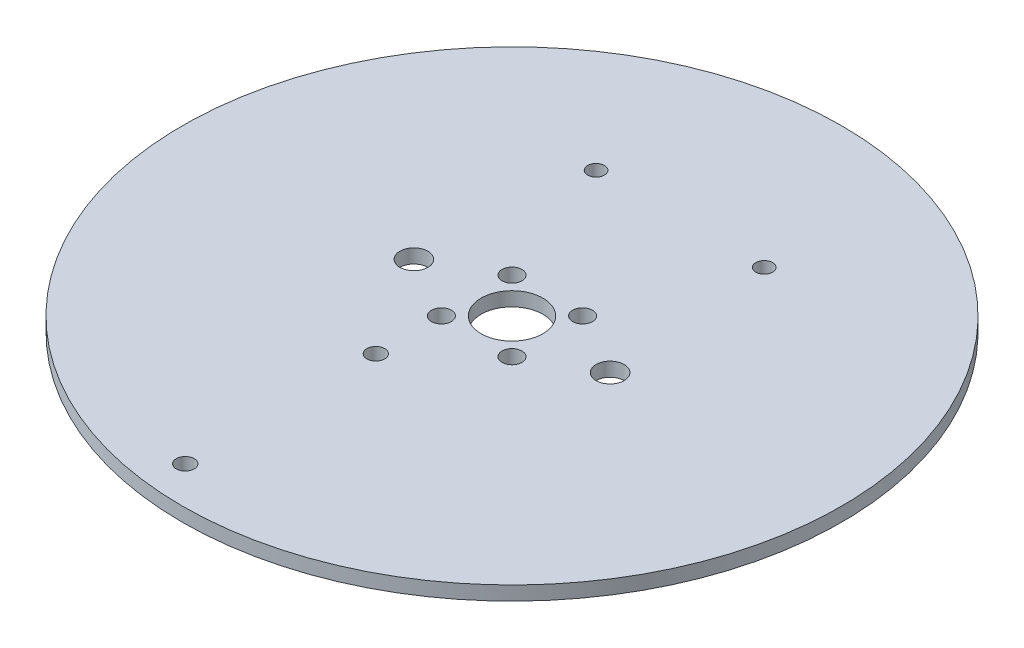
ISO-10303-21;
HEADER;
FILE_DESCRIPTION(('STEP AP214'),'2;1');
FILE_NAME('part.step','',(''),(''),'','','');
FILE_SCHEMA(('AUTOMOTIVE_DESIGN { 1 0 10303 214 1 1 1 1 }'));
ENDSEC;
DATA;
#1=APPLICATION_CONTEXT('core data for automotive mechanical design processes');
#2=APPLICATION_PROTOCOL_DEFINITION('international standard','automotive_design',2000,#1);
#3=PRODUCT_CONTEXT('',#1,'mechanical');
#4=PRODUCT('Part','Part','',(#3));
#5=PRODUCT_RELATED_PRODUCT_CATEGORY('part','',(#4));
#6=PRODUCT_DEFINITION_FORMATION('','',#4);
#7=PRODUCT_DEFINITION_CONTEXT('part definition',#1,'design');
#8=PRODUCT_DEFINITION('design','',#6,#7);
#9=PRODUCT_DEFINITION_SHAPE('','',#8);
#10=(LENGTH_UNIT() NAMED_UNIT(*) SI_UNIT(.MILLI.,.METRE.));
#11=(NAMED_UNIT(*) PLANE_ANGLE_UNIT() SI_UNIT($,.RADIAN.));
#12=(NAMED_UNIT(*) SI_UNIT($,.STERADIAN.) SOLID_ANGLE_UNIT());
#13=UNCERTAINTY_MEASURE_WITH_UNIT(LENGTH_MEASURE(1.E-05),#10,'distance_accuracy_value','');
#14=(GEOMETRIC_REPRESENTATION_CONTEXT(3) GLOBAL_UNCERTAINTY_ASSIGNED_CONTEXT((#13)) GLOBAL_UNIT_ASSIGNED_CONTEXT((#10,
#11,#12)) REPRESENTATION_CONTEXT('',''));
#15=CARTESIAN_POINT('',(0.,0.,0.));
#16=DIRECTION('',(0.,0.,1.));
#17=DIRECTION('',(1.,0.,0.));
#18=AXIS2_PLACEMENT_3D('',#15,#16,#17);
#19=CARTESIAN_POINT('',(0.,3.175,0.));
#20=DIRECTION('',(0.,-1.,0.));
#21=DIRECTION('',(0.,0.,-1.));
#22=AXIS2_PLACEMENT_3D('',#19,#20,#21);
#23=CYLINDRICAL_SURFACE('',#22,74.676);
#24=CARTESIAN_POINT('',(0.,3.175,0.));
#25=DIRECTION('',(0.,1.,0.));
#26=DIRECTION('',(0.,0.,1.));
#27=AXIS2_PLACEMENT_3D('',#24,#25,#26);
#28=CIRCLE('',#27,74.676);
#29=CARTESIAN_POINT('',(0.,3.175,74.676));
#30=VERTEX_POINT('',#29);
#31=EDGE_CURVE('E10',#30,#30,#28,.T.);
#32=ORIENTED_EDGE('',*,*,#31,.F.);
#33=EDGE_LOOP('',(#32));
#34=FACE_BOUND('',#33,.T.);
#35=CARTESIAN_POINT('',(0.,0.,0.));
#36=DIRECTION('',(0.,1.,0.));
#37=DIRECTION('',(0.,0.,1.));
#38=AXIS2_PLACEMENT_3D('',#35,#36,#37);
#39=CIRCLE('',#38,74.676);
#40=CARTESIAN_POINT('',(0.,0.,74.676));
#41=VERTEX_POINT('',#40);
#42=EDGE_CURVE('E34',#41,#41,#39,.T.);
#43=ORIENTED_EDGE('',*,*,#42,.T.);
#44=EDGE_LOOP('',(#43));
#45=FACE_BOUND('',#44,.T.);
#46=ADVANCED_FACE('F31',(#34,#45),#23,.T.);
#47=CARTESIAN_POINT('',(0.,3.175,0.));
#48=DIRECTION('',(0.,1.,0.));
#49=DIRECTION('',(0.,0.,1.));
#50=AXIS2_PLACEMENT_3D('',#47,#48,#49);
#51=PLANE('',#50);
#52=CARTESIAN_POINT('',(-8.,3.175,22.86));
#53=DIRECTION('',(0.,1.,0.));
#54=DIRECTION('',(0.,0.,1.));
#55=AXIS2_PLACEMENT_3D('',#52,#53,#54);
#56=CIRCLE('',#55,2.032);
#57=CARTESIAN_POINT('',(-8.,3.175,24.892));
#58=VERTEX_POINT('',#57);
#59=EDGE_CURVE('E100',#58,#58,#56,.T.);
#60=ORIENTED_EDGE('',*,*,#59,.F.);
#61=EDGE_LOOP('',(#60));
#62=FACE_BOUND('',#61,.T.);
#63=CARTESIAN_POINT('',(-8.,3.175,66.04));
#64=DIRECTION('',(0.,1.,0.));
#65=DIRECTION('',(0.,0.,1.));
#66=AXIS2_PLACEMENT_3D('',#63,#64,#65);
#67=CIRCLE('',#66,2.032);
#68=CARTESIAN_POINT('',(-8.,3.175,68.072));
#69=VERTEX_POINT('',#68);
#70=EDGE_CURVE('E101',#69,#69,#67,.T.);
#71=ORIENTED_EDGE('',*,*,#70,.F.);
#72=EDGE_LOOP('',(#71));
#73=FACE_BOUND('',#72,.T.);
#74=CARTESIAN_POINT('',(19.05,3.175,-38.1));
#75=DIRECTION('',(0.,1.,0.));
#76=DIRECTION('',(0.,0.,1.));
#77=AXIS2_PLACEMENT_3D('',#74,#75,#76);
#78=CIRCLE('',#77,1.89865000000001);
#79=CARTESIAN_POINT('',(19.05,3.175,-36.20135));
#80=VERTEX_POINT('',#79);
#81=EDGE_CURVE('E88',#80,#80,#78,.T.);
#82=ORIENTED_EDGE('',*,*,#81,.F.);
#83=EDGE_LOOP('',(#82));
#84=FACE_BOUND('',#83,.T.);
#85=CARTESIAN_POINT('',(-19.05,3.175,-38.1));
#86=DIRECTION('',(0.,1.,0.));
#87=DIRECTION('',(0.,0.,1.));
#88=AXIS2_PLACEMENT_3D('',#85,#86,#87);
#89=CIRCLE('',#88,1.89865);
#90=CARTESIAN_POINT('',(-19.05,3.175,-36.20135));
#91=VERTEX_POINT('',#90);
#92=EDGE_CURVE('E89',#91,#91,#89,.T.);
#93=ORIENTED_EDGE('',*,*,#92,.F.);
#94=EDGE_LOOP('',(#93));
#95=FACE_BOUND('',#94,.T.);
#96=CARTESIAN_POINT('',(-8.,3.175,-8.));
#97=DIRECTION('',(0.,1.,0.));
#98=DIRECTION('',(0.,0.,1.));
#99=AXIS2_PLACEMENT_3D('',#96,#97,#98);
#100=CIRCLE('',#99,2.25);
#101=CARTESIAN_POINT('',(-8.,3.175,-5.75));
#102=VERTEX_POINT('',#101);
#103=EDGE_CURVE('E81',#102,#102,#100,.T.);
#104=ORIENTED_EDGE('',*,*,#103,.F.);
#105=EDGE_LOOP('',(#104));
#106=FACE_BOUND('',#105,.T.);
#107=CARTESIAN_POINT('',(8.,3.175,-8.));
#108=DIRECTION('',(0.,1.,0.));
#109=DIRECTION('',(0.,0.,1.));
#110=AXIS2_PLACEMENT_3D('',#107,#108,#109);
#111=CIRCLE('',#110,2.25);
#112=CARTESIAN_POINT('',(8.,3.175,-5.75));
#113=VERTEX_POINT('',#112);
#114=EDGE_CURVE('E75',#113,#113,#111,.T.);
#115=ORIENTED_EDGE('',*,*,#114,.F.);
#116=EDGE_LOOP('',(#115));
#117=FACE_BOUND('',#116,.T.);
#118=CARTESIAN_POINT('',(8.,3.175,8.));
#119=DIRECTION('',(0.,1.,0.));
#120=DIRECTION('',(0.,0.,1.));
#121=AXIS2_PLACEMENT_3D('',#118,#119,#120);
#122=CIRCLE('',#121,2.25);
#123=CARTESIAN_POINT('',(8.,3.175,10.25));
#124=VERTEX_POINT('',#123);
#125=EDGE_CURVE('E69',#124,#124,#122,.T.);
#126=ORIENTED_EDGE('',*,*,#125,.F.);
#127=EDGE_LOOP('',(#126));
#128=FACE_BOUND('',#127,.T.);
#129=CARTESIAN_POINT('',(-8.,3.175,8.));
#130=DIRECTION('',(0.,1.,0.));
#131=DIRECTION('',(0.,0.,1.));
#132=AXIS2_PLACEMENT_3D('',#129,#130,#131);
#133=CIRCLE('',#132,2.25);
#134=CARTESIAN_POINT('',(-8.,3.175,10.25));
#135=VERTEX_POINT('',#134);
#136=EDGE_CURVE('E63',#135,#135,#133,.T.);
#137=ORIENTED_EDGE('',*,*,#136,.F.);
#138=EDGE_LOOP('',(#137));
#139=FACE_BOUND('',#138,.T.);
#140=CARTESIAN_POINT('',(-22.225,3.175,0.));
#141=DIRECTION('',(0.,1.,0.));
#142=DIRECTION('',(0.,0.,1.));
#143=AXIS2_PLACEMENT_3D('',#140,#141,#142);
#144=CIRCLE('',#143,3.17500000000001);
#145=CARTESIAN_POINT('',(-22.225,3.175,3.17500000000001));
#146=VERTEX_POINT('',#145);
#147=EDGE_CURVE('E56',#146,#146,#144,.T.);
#148=ORIENTED_EDGE('',*,*,#147,.F.);
#149=EDGE_LOOP('',(#148));
#150=FACE_BOUND('',#149,.T.);
#151=CARTESIAN_POINT('',(22.225,3.175,0.));
#152=DIRECTION('',(0.,1.,0.));
#153=DIRECTION('',(0.,0.,1.));
#154=AXIS2_PLACEMENT_3D('',#151,#152,#153);
#155=CIRCLE('',#154,3.17500000000001);
#156=CARTESIAN_POINT('',(22.225,3.175,3.17500000000001));
#157=VERTEX_POINT('',#156);
#158=EDGE_CURVE('E49',#157,#157,#155,.T.);
#159=ORIENTED_EDGE('',*,*,#158,.F.);
#160=EDGE_LOOP('',(#159));
#161=FACE_BOUND('',#160,.T.);
#162=CARTESIAN_POINT('',(0.,3.175,0.));
#163=DIRECTION('',(0.,1.,0.));
#164=DIRECTION('',(0.,0.,1.));
#165=AXIS2_PLACEMENT_3D('',#162,#163,#164);
#166=CIRCLE('',#165,7.);
#167=CARTESIAN_POINT('',(0.,3.175,7.));
#168=VERTEX_POINT('',#167);
#169=EDGE_CURVE('E45',#168,#168,#166,.T.);
#170=ORIENTED_EDGE('',*,*,#169,.F.);
#171=EDGE_LOOP('',(#170));
#172=FACE_BOUND('',#171,.T.);
#173=ORIENTED_EDGE('',*,*,#31,.T.);
#174=EDGE_LOOP('',(#173));
#175=FACE_BOUND('',#174,.T.);
#176=ADVANCED_FACE('F112',(#62,#73,#84,#95,#106,#117,#128,#139,#150,#161,#172,#175),#51,.T.);
#177=CARTESIAN_POINT('',(0.,0.,0.));
#178=DIRECTION('',(0.,1.,0.));
#179=DIRECTION('',(0.,0.,1.));
#180=AXIS2_PLACEMENT_3D('',#177,#178,#179);
#181=PLANE('',#180);
#182=CARTESIAN_POINT('',(-8.,0.,22.86));
#183=DIRECTION('',(0.,1.,0.));
#184=DIRECTION('',(0.,0.,1.));
#185=AXIS2_PLACEMENT_3D('',#182,#183,#184);
#186=CIRCLE('',#185,2.032);
#187=CARTESIAN_POINT('',(-8.,0.,24.892));
#188=VERTEX_POINT('',#187);
#189=EDGE_CURVE('E92',#188,#188,#186,.F.);
#190=ORIENTED_EDGE('',*,*,#189,.F.);
#191=EDGE_LOOP('',(#190));
#192=FACE_BOUND('',#191,.T.);
#193=CARTESIAN_POINT('',(-8.,0.,66.04));
#194=DIRECTION('',(0.,1.,0.));
#195=DIRECTION('',(0.,0.,1.));
#196=AXIS2_PLACEMENT_3D('',#193,#194,#195);
#197=CIRCLE('',#196,2.032);
#198=CARTESIAN_POINT('',(-8.,0.,68.072));
#199=VERTEX_POINT('',#198);
#200=EDGE_CURVE('E97',#199,#199,#197,.F.);
#201=ORIENTED_EDGE('',*,*,#200,.F.);
#202=EDGE_LOOP('',(#201));
#203=FACE_BOUND('',#202,.T.);
#204=CARTESIAN_POINT('',(19.05,0.,-38.1));
#205=DIRECTION('',(0.,1.,0.));
#206=DIRECTION('',(0.,0.,1.));
#207=AXIS2_PLACEMENT_3D('',#204,#205,#206);
#208=CIRCLE('',#207,1.89865000000001);
#209=CARTESIAN_POINT('',(19.05,0.,-36.20135));
#210=VERTEX_POINT('',#209);
#211=EDGE_CURVE('E84',#210,#210,#208,.F.);
#212=ORIENTED_EDGE('',*,*,#211,.F.);
#213=EDGE_LOOP('',(#212));
#214=FACE_BOUND('',#213,.T.);
#215=CARTESIAN_POINT('',(-19.05,0.,-38.1));
#216=DIRECTION('',(0.,1.,0.));
#217=DIRECTION('',(0.,0.,1.));
#218=AXIS2_PLACEMENT_3D('',#215,#216,#217);
#219=CIRCLE('',#218,1.89865);
#220=CARTESIAN_POINT('',(-19.05,0.,-36.20135));
#221=VERTEX_POINT('',#220);
#222=EDGE_CURVE('E85',#221,#221,#219,.F.);
#223=ORIENTED_EDGE('',*,*,#222,.F.);
#224=EDGE_LOOP('',(#223));
#225=FACE_BOUND('',#224,.T.);
#226=CARTESIAN_POINT('',(-8.,0.,-8.));
#227=DIRECTION('',(0.,1.,0.));
#228=DIRECTION('',(0.,0.,1.));
#229=AXIS2_PLACEMENT_3D('',#226,#227,#228);
#230=CIRCLE('',#229,2.25);
#231=CARTESIAN_POINT('',(-8.,0.,-5.75));
#232=VERTEX_POINT('',#231);
#233=EDGE_CURVE('E78',#232,#232,#230,.T.);
#234=ORIENTED_EDGE('',*,*,#233,.T.);
#235=EDGE_LOOP('',(#234));
#236=FACE_BOUND('',#235,.T.);
#237=CARTESIAN_POINT('',(8.,0.,-8.));
#238=DIRECTION('',(0.,1.,0.));
#239=DIRECTION('',(0.,0.,1.));
#240=AXIS2_PLACEMENT_3D('',#237,#238,#239);
#241=CIRCLE('',#240,2.25);
#242=CARTESIAN_POINT('',(8.,0.,-5.75));
#243=VERTEX_POINT('',#242);
#244=EDGE_CURVE('E72',#243,#243,#241,.T.);
#245=ORIENTED_EDGE('',*,*,#244,.T.);
#246=EDGE_LOOP('',(#245));
#247=FACE_BOUND('',#246,.T.);
#248=CARTESIAN_POINT('',(8.,0.,8.));
#249=DIRECTION('',(0.,1.,0.));
#250=DIRECTION('',(0.,0.,1.));
#251=AXIS2_PLACEMENT_3D('',#248,#249,#250);
#252=CIRCLE('',#251,2.25);
#253=CARTESIAN_POINT('',(8.,0.,10.25));
#254=VERTEX_POINT('',#253);
#255=EDGE_CURVE('E66',#254,#254,#252,.T.);
#256=ORIENTED_EDGE('',*,*,#255,.T.);
#257=EDGE_LOOP('',(#256));
#258=FACE_BOUND('',#257,.T.);
#259=CARTESIAN_POINT('',(-8.,0.,8.));
#260=DIRECTION('',(0.,1.,0.));
#261=DIRECTION('',(0.,0.,1.));
#262=AXIS2_PLACEMENT_3D('',#259,#260,#261);
#263=CIRCLE('',#262,2.25);
#264=CARTESIAN_POINT('',(-8.,0.,10.25));
#265=VERTEX_POINT('',#264);
#266=EDGE_CURVE('E53',#265,#265,#263,.T.);
#267=ORIENTED_EDGE('',*,*,#266,.T.);
#268=EDGE_LOOP('',(#267));
#269=FACE_BOUND('',#268,.T.);
#270=CARTESIAN_POINT('',(-22.225,0.,0.));
#271=DIRECTION('',(0.,1.,0.));
#272=DIRECTION('',(0.,0.,1.));
#273=AXIS2_PLACEMENT_3D('',#270,#271,#272);
#274=CIRCLE('',#273,3.17500000000001);
#275=CARTESIAN_POINT('',(-22.225,0.,3.17500000000001));
#276=VERTEX_POINT('',#275);
#277=EDGE_CURVE('E48',#276,#276,#274,.T.);
#278=ORIENTED_EDGE('',*,*,#277,.T.);
#279=EDGE_LOOP('',(#278));
#280=FACE_BOUND('',#279,.T.);
#281=CARTESIAN_POINT('',(22.225,0.,0.));
#282=DIRECTION('',(0.,1.,0.));
#283=DIRECTION('',(0.,0.,1.));
#284=AXIS2_PLACEMENT_3D('',#281,#282,#283);
#285=CIRCLE('',#284,3.17500000000001);
#286=CARTESIAN_POINT('',(22.225,0.,3.17500000000001));
#287=VERTEX_POINT('',#286);
#288=EDGE_CURVE('E52',#287,#287,#285,.T.);
#289=ORIENTED_EDGE('',*,*,#288,.T.);
#290=EDGE_LOOP('',(#289));
#291=FACE_BOUND('',#290,.T.);
#292=CARTESIAN_POINT('',(0.,0.,0.));
#293=DIRECTION('',(0.,1.,0.));
#294=DIRECTION('',(0.,0.,1.));
#295=AXIS2_PLACEMENT_3D('',#292,#293,#294);
#296=CIRCLE('',#295,7.);
#297=CARTESIAN_POINT('',(0.,0.,7.));
#298=VERTEX_POINT('',#297);
#299=EDGE_CURVE('E41',#298,#298,#296,.F.);
#300=ORIENTED_EDGE('',*,*,#299,.F.);
#301=EDGE_LOOP('',(#300));
#302=FACE_BOUND('',#301,.T.);
#303=ORIENTED_EDGE('',*,*,#42,.F.);
#304=EDGE_LOOP('',(#303));
#305=FACE_BOUND('',#304,.T.);
#306=ADVANCED_FACE('F115',(#192,#203,#214,#225,#236,#247,#258,#269,#280,#291,#302,#305),#181,.F.);
#307=CARTESIAN_POINT('',(0.,-0.00100000000000013,0.));
#308=DIRECTION('',(0.,1.,0.));
#309=DIRECTION('',(0.,0.,1.));
#310=AXIS2_PLACEMENT_3D('',#307,#308,#309);
#311=CYLINDRICAL_SURFACE('',#310,7.);
#312=ORIENTED_EDGE('',*,*,#169,.T.);
#313=EDGE_LOOP('',(#312));
#314=FACE_BOUND('',#313,.T.);
#315=ORIENTED_EDGE('',*,*,#299,.T.);
#316=EDGE_LOOP('',(#315));
#317=FACE_BOUND('',#316,.T.);
#318=ADVANCED_FACE('F137',(#314,#317),#311,.F.);
#319=CARTESIAN_POINT('',(22.225,0.,0.));
#320=DIRECTION('',(0.,1.,0.));
#321=DIRECTION('',(0.,0.,1.));
#322=AXIS2_PLACEMENT_3D('',#319,#320,#321);
#323=CYLINDRICAL_SURFACE('',#322,3.17500000000001);
#324=ORIENTED_EDGE('',*,*,#288,.F.);
#325=EDGE_LOOP('',(#324));
#326=FACE_BOUND('',#325,.T.);
#327=ORIENTED_EDGE('',*,*,#158,.T.);
#328=EDGE_LOOP('',(#327));
#329=FACE_BOUND('',#328,.T.);
#330=ADVANCED_FACE('F140',(#326,#329),#323,.F.);
#331=CARTESIAN_POINT('',(-22.225,0.,0.));
#332=DIRECTION('',(0.,1.,0.));
#333=DIRECTION('',(0.,0.,1.));
#334=AXIS2_PLACEMENT_3D('',#331,#332,#333);
#335=CYLINDRICAL_SURFACE('',#334,3.17500000000001);
#336=ORIENTED_EDGE('',*,*,#277,.F.);
#337=EDGE_LOOP('',(#336));
#338=FACE_BOUND('',#337,.T.);
#339=ORIENTED_EDGE('',*,*,#147,.T.);
#340=EDGE_LOOP('',(#339));
#341=FACE_BOUND('',#340,.T.);
#342=ADVANCED_FACE('F173',(#338,#341),#335,.F.);
#343=CARTESIAN_POINT('',(-8.,3.175,8.));
#344=DIRECTION('',(0.,1.,0.));
#345=DIRECTION('',(0.,0.,1.));
#346=AXIS2_PLACEMENT_3D('',#343,#344,#345);
#347=CYLINDRICAL_SURFACE('',#346,2.25);
#348=ORIENTED_EDGE('',*,*,#266,.F.);
#349=EDGE_LOOP('',(#348));
#350=FACE_BOUND('',#349,.T.);
#351=ORIENTED_EDGE('',*,*,#136,.T.);
#352=EDGE_LOOP('',(#351));
#353=FACE_BOUND('',#352,.T.);
#354=ADVANCED_FACE('F181',(#350,#353),#347,.F.);
#355=CARTESIAN_POINT('',(8.,3.175,8.));
#356=DIRECTION('',(0.,1.,0.));
#357=DIRECTION('',(0.,0.,1.));
#358=AXIS2_PLACEMENT_3D('',#355,#356,#357);
#359=CYLINDRICAL_SURFACE('',#358,2.25);
#360=ORIENTED_EDGE('',*,*,#255,.F.);
#361=EDGE_LOOP('',(#360));
#362=FACE_BOUND('',#361,.T.);
#363=ORIENTED_EDGE('',*,*,#125,.T.);
#364=EDGE_LOOP('',(#363));
#365=FACE_BOUND('',#364,.T.);
#366=ADVANCED_FACE('F189',(#362,#365),#359,.F.);
#367=CARTESIAN_POINT('',(8.,3.175,-8.));
#368=DIRECTION('',(0.,1.,0.));
#369=DIRECTION('',(0.,0.,1.));
#370=AXIS2_PLACEMENT_3D('',#367,#368,#369);
#371=CYLINDRICAL_SURFACE('',#370,2.25);
#372=ORIENTED_EDGE('',*,*,#244,.F.);
#373=EDGE_LOOP('',(#372));
#374=FACE_BOUND('',#373,.T.);
#375=ORIENTED_EDGE('',*,*,#114,.T.);
#376=EDGE_LOOP('',(#375));
#377=FACE_BOUND('',#376,.T.);
#378=ADVANCED_FACE('F197',(#374,#377),#371,.F.);
#379=CARTESIAN_POINT('',(-8.,3.175,-8.));
#380=DIRECTION('',(0.,1.,0.));
#381=DIRECTION('',(0.,0.,1.));
#382=AXIS2_PLACEMENT_3D('',#379,#380,#381);
#383=CYLINDRICAL_SURFACE('',#382,2.25);
#384=ORIENTED_EDGE('',*,*,#233,.F.);
#385=EDGE_LOOP('',(#384));
#386=FACE_BOUND('',#385,.T.);
#387=ORIENTED_EDGE('',*,*,#103,.T.);
#388=EDGE_LOOP('',(#387));
#389=FACE_BOUND('',#388,.T.);
#390=ADVANCED_FACE('F205',(#386,#389),#383,.F.);
#391=CARTESIAN_POINT('',(-19.05,-0.00100000000000013,-38.1));
#392=DIRECTION('',(0.,1.,0.));
#393=DIRECTION('',(0.,0.,1.));
#394=AXIS2_PLACEMENT_3D('',#391,#392,#393);
#395=CYLINDRICAL_SURFACE('',#394,1.89865);
#396=ORIENTED_EDGE('',*,*,#92,.T.);
#397=EDGE_LOOP('',(#396));
#398=FACE_BOUND('',#397,.T.);
#399=ORIENTED_EDGE('',*,*,#222,.T.);
#400=EDGE_LOOP('',(#399));
#401=FACE_BOUND('',#400,.T.);
#402=ADVANCED_FACE('F213',(#398,#401),#395,.F.);
#403=CARTESIAN_POINT('',(19.05,-0.00100000000000013,-38.1));
#404=DIRECTION('',(0.,1.,0.));
#405=DIRECTION('',(0.,0.,1.));
#406=AXIS2_PLACEMENT_3D('',#403,#404,#405);
#407=CYLINDRICAL_SURFACE('',#406,1.89865000000001);
#408=ORIENTED_EDGE('',*,*,#81,.T.);
#409=EDGE_LOOP('',(#408));
#410=FACE_BOUND('',#409,.T.);
#411=ORIENTED_EDGE('',*,*,#211,.T.);
#412=EDGE_LOOP('',(#411));
#413=FACE_BOUND('',#412,.T.);
#414=ADVANCED_FACE('F221',(#410,#413),#407,.F.);
#415=CARTESIAN_POINT('',(-8.,-0.00100000000000013,66.04));
#416=DIRECTION('',(0.,1.,0.));
#417=DIRECTION('',(0.,0.,1.));
#418=AXIS2_PLACEMENT_3D('',#415,#416,#417);
#419=CYLINDRICAL_SURFACE('',#418,2.032);
#420=ORIENTED_EDGE('',*,*,#70,.T.);
#421=EDGE_LOOP('',(#420));
#422=FACE_BOUND('',#421,.T.);
#423=ORIENTED_EDGE('',*,*,#200,.T.);
#424=EDGE_LOOP('',(#423));
#425=FACE_BOUND('',#424,.T.);
#426=ADVANCED_FACE('F228',(#422,#425),#419,.F.);
#427=CARTESIAN_POINT('',(-8.,-0.00100000000000013,22.86));
#428=DIRECTION('',(0.,1.,0.));
#429=DIRECTION('',(0.,0.,1.));
#430=AXIS2_PLACEMENT_3D('',#427,#428,#429);
#431=CYLINDRICAL_SURFACE('',#430,2.032);
#432=ORIENTED_EDGE('',*,*,#59,.T.);
#433=EDGE_LOOP('',(#432));
#434=FACE_BOUND('',#433,.T.);
#435=ORIENTED_EDGE('',*,*,#189,.T.);
#436=EDGE_LOOP('',(#435));
#437=FACE_BOUND('',#436,.T.);
#438=ADVANCED_FACE('F109',(#434,#437),#431,.F.);
#439=CLOSED_SHELL('',(#46,#176,#306,#318,#330,#342,#354,#366,#378,#390,#402,#414,#426,#438));
#440=MANIFOLD_SOLID_BREP('B2',#439);
#441=ADVANCED_BREP_SHAPE_REPRESENTATION('',(#18,#440),#14);
#442=SHAPE_DEFINITION_REPRESENTATION(#9,#441);
ENDSEC;
END-ISO-10303-21;
